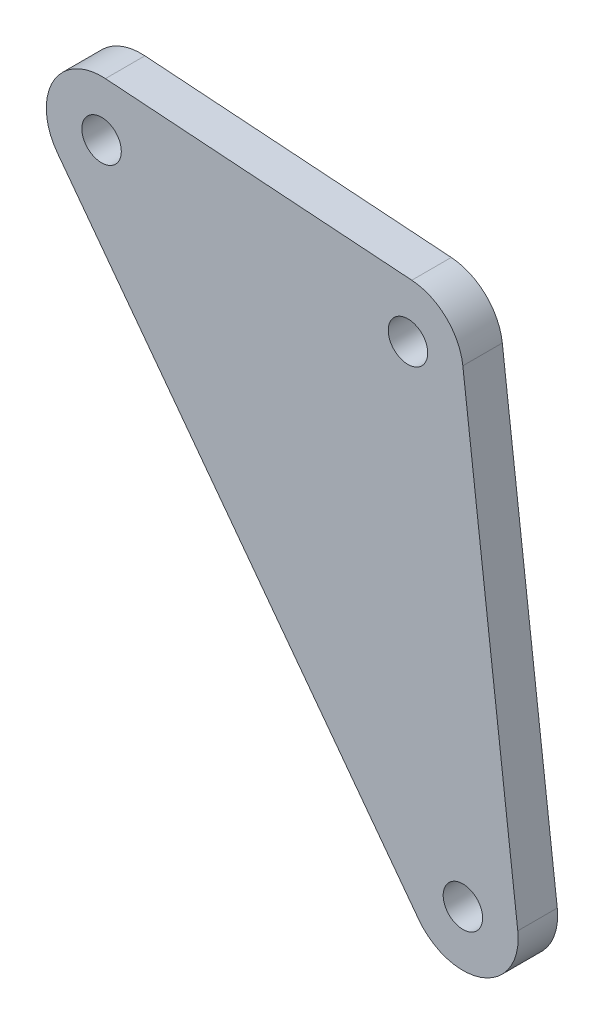
ISO-10303-21;
HEADER;
FILE_DESCRIPTION(('STEP AP214'),'2;1');
FILE_NAME('part.step','',(''),(''),'','','');
FILE_SCHEMA(('AUTOMOTIVE_DESIGN { 1 0 10303 214 1 1 1 1 }'));
ENDSEC;
DATA;
#1=APPLICATION_CONTEXT('core data for automotive mechanical design processes');
#2=APPLICATION_PROTOCOL_DEFINITION('international standard','automotive_design',2000,#1);
#3=PRODUCT_CONTEXT('',#1,'mechanical');
#4=PRODUCT('Part','Part','',(#3));
#5=PRODUCT_RELATED_PRODUCT_CATEGORY('part','',(#4));
#6=PRODUCT_DEFINITION_FORMATION('','',#4);
#7=PRODUCT_DEFINITION_CONTEXT('part definition',#1,'design');
#8=PRODUCT_DEFINITION('design','',#6,#7);
#9=PRODUCT_DEFINITION_SHAPE('','',#8);
#10=(LENGTH_UNIT() NAMED_UNIT(*) SI_UNIT(.MILLI.,.METRE.));
#11=(NAMED_UNIT(*) PLANE_ANGLE_UNIT() SI_UNIT($,.RADIAN.));
#12=(NAMED_UNIT(*) SI_UNIT($,.STERADIAN.) SOLID_ANGLE_UNIT());
#13=UNCERTAINTY_MEASURE_WITH_UNIT(LENGTH_MEASURE(1.E-05),#10,'distance_accuracy_value','');
#14=(GEOMETRIC_REPRESENTATION_CONTEXT(3) GLOBAL_UNCERTAINTY_ASSIGNED_CONTEXT((#13)) GLOBAL_UNIT_ASSIGNED_CONTEXT((#10,
#11,#12)) REPRESENTATION_CONTEXT('',''));
#15=CARTESIAN_POINT('',(0.,0.,0.));
#16=DIRECTION('',(0.,0.,1.));
#17=DIRECTION('',(1.,0.,0.));
#18=AXIS2_PLACEMENT_3D('',#15,#16,#17);
#19=CARTESIAN_POINT('',(0.,0.,6.35));
#20=DIRECTION('',(0.,0.,-1.));
#21=DIRECTION('',(-1.,0.,0.));
#22=AXIS2_PLACEMENT_3D('',#19,#20,#21);
#23=PLANE('',#22);
#24=DIRECTION('',(0.598839337600223,-0.800869182665013,0.));
#25=VECTOR('',#24,1.);
#26=CARTESIAN_POINT('',(63.0456676660732,-140.545952681482,6.35));
#27=LINE('',#26,#25);
#28=CARTESIAN_POINT('',(-14.9492145962334,-36.238012826056,6.35));
#29=VERTEX_POINT('',#28);
#30=CARTESIAN_POINT('',(43.1777245472698,-113.975180910618,6.35));
#31=VERTEX_POINT('',#30);
#32=EDGE_CURVE('E122',#29,#31,#27,.T.);
#33=ORIENTED_EDGE('',*,*,#32,.T.);
#34=CARTESIAN_POINT('',(50.2974515811618,-108.651499199352,6.35));
#35=DIRECTION('',(0.,0.,-1.));
#36=DIRECTION('',(-1.,0.,0.));
#37=AXIS2_PLACEMENT_3D('',#34,#35,#36);
#38=CIRCLE('',#37,8.89);
#39=CARTESIAN_POINT('',(59.1251650461889,-107.600987429128,6.35));
#40=VERTEX_POINT('',#39);
#41=EDGE_CURVE('E140',#31,#40,#38,.F.);
#42=ORIENTED_EDGE('',*,*,#41,.T.);
#43=DIRECTION('',(-0.118167803174829,0.99299364061047,0.));
#44=VECTOR('',#43,1.);
#45=CARTESIAN_POINT('',(49.4147627950383,-26.00204571997,6.35));
#46=LINE('',#45,#44);
#47=CARTESIAN_POINT('',(50.2840863482545,-33.3071892259338,6.35));
#48=VERTEX_POINT('',#47);
#49=EDGE_CURVE('E112',#40,#48,#46,.T.);
#50=ORIENTED_EDGE('',*,*,#49,.T.);
#51=CARTESIAN_POINT('',(41.4563728832274,-34.3577009961581,6.35));
#52=DIRECTION('',(0.,0.,-1.));
#53=DIRECTION('',(-1.,0.,0.));
#54=AXIS2_PLACEMENT_3D('',#51,#52,#53);
#55=CIRCLE('',#54,8.89);
#56=CARTESIAN_POINT('',(42.0759648001072,-25.489318626383,6.35));
#57=VERTEX_POINT('',#56);
#58=EDGE_CURVE('E56',#48,#57,#55,.F.);
#59=ORIENTED_EDGE('',*,*,#58,.T.);
#60=DIRECTION('',(-0.997568320559625,0.0696953787266334,0.));
#61=VECTOR('',#60,1.);
#62=CARTESIAN_POINT('',(-26.5726702065041,-20.6931632982265,6.35));
#63=LINE('',#62,#61);
#64=CARTESIAN_POINT('',(-7.20989564546165,-22.0459487450149,6.35));
#65=VERTEX_POINT('',#64);
#66=EDGE_CURVE('E130',#57,#65,#63,.T.);
#67=ORIENTED_EDGE('',*,*,#66,.T.);
#68=CARTESIAN_POINT('',(-7.82948756234142,-30.91433111479,6.35));
#69=DIRECTION('',(0.,0.,-1.));
#70=DIRECTION('',(-1.,0.,0.));
#71=AXIS2_PLACEMENT_3D('',#68,#69,#70);
#72=CIRCLE('',#71,8.89);
#73=EDGE_CURVE('E131',#65,#29,#72,.F.);
#74=ORIENTED_EDGE('',*,*,#73,.T.);
#75=EDGE_LOOP('',(#33,#42,#50,#59,#67,#74));
#76=FACE_BOUND('',#75,.T.);
#77=CARTESIAN_POINT('',(-7.82948756234141,-30.91433111479,6.35));
#78=DIRECTION('',(0.,0.,1.));
#79=DIRECTION('',(1.,0.,0.));
#80=AXIS2_PLACEMENT_3D('',#77,#78,#79);
#81=CIRCLE('',#80,3.175);
#82=CARTESIAN_POINT('',(-4.65448756234141,-30.91433111479,6.35));
#83=VERTEX_POINT('',#82);
#84=EDGE_CURVE('E124',#83,#83,#81,.T.);
#85=ORIENTED_EDGE('',*,*,#84,.F.);
#86=EDGE_LOOP('',(#85));
#87=FACE_BOUND('',#86,.T.);
#88=CARTESIAN_POINT('',(41.4563728832274,-34.3577009961581,6.35));
#89=DIRECTION('',(0.,0.,1.));
#90=DIRECTION('',(1.,0.,0.));
#91=AXIS2_PLACEMENT_3D('',#88,#89,#90);
#92=CIRCLE('',#91,3.175);
#93=CARTESIAN_POINT('',(44.6313728832274,-34.3577009961581,6.35));
#94=VERTEX_POINT('',#93);
#95=EDGE_CURVE('E163',#94,#94,#92,.T.);
#96=ORIENTED_EDGE('',*,*,#95,.F.);
#97=EDGE_LOOP('',(#96));
#98=FACE_BOUND('',#97,.T.);
#99=CARTESIAN_POINT('',(50.2974515811618,-108.651499199352,6.35));
#100=DIRECTION('',(0.,0.,1.));
#101=DIRECTION('',(1.,0.,0.));
#102=AXIS2_PLACEMENT_3D('',#99,#100,#101);
#103=CIRCLE('',#102,3.175);
#104=CARTESIAN_POINT('',(53.4724515811618,-108.651499199352,6.35));
#105=VERTEX_POINT('',#104);
#106=EDGE_CURVE('E170',#105,#105,#103,.T.);
#107=ORIENTED_EDGE('',*,*,#106,.F.);
#108=EDGE_LOOP('',(#107));
#109=FACE_BOUND('',#108,.T.);
#110=ADVANCED_FACE('F39',(#76,#87,#98,#109),#23,.F.);
#111=CARTESIAN_POINT('',(0.,0.,0.));
#112=DIRECTION('',(0.,0.,-1.));
#113=DIRECTION('',(-1.,0.,0.));
#114=AXIS2_PLACEMENT_3D('',#111,#112,#113);
#115=PLANE('',#114);
#116=CARTESIAN_POINT('',(41.4563728832274,-34.3577009961581,0.));
#117=DIRECTION('',(0.,0.,1.));
#118=DIRECTION('',(1.,0.,0.));
#119=AXIS2_PLACEMENT_3D('',#116,#117,#118);
#120=CIRCLE('',#119,3.175);
#121=CARTESIAN_POINT('',(44.6313728832274,-34.3577009961581,0.));
#122=VERTEX_POINT('',#121);
#123=EDGE_CURVE('E166',#122,#122,#120,.T.);
#124=ORIENTED_EDGE('',*,*,#123,.T.);
#125=EDGE_LOOP('',(#124));
#126=FACE_BOUND('',#125,.T.);
#127=DIRECTION('',(-0.118167803174829,0.99299364061047,0.));
#128=VECTOR('',#127,1.);
#129=CARTESIAN_POINT('',(49.4147627950383,-26.00204571997,0.));
#130=LINE('',#129,#128);
#131=CARTESIAN_POINT('',(59.1251650461889,-107.600987429128,0.));
#132=VERTEX_POINT('',#131);
#133=CARTESIAN_POINT('',(50.2840863482545,-33.3071892259338,0.));
#134=VERTEX_POINT('',#133);
#135=EDGE_CURVE('E108',#132,#134,#130,.T.);
#136=ORIENTED_EDGE('',*,*,#135,.F.);
#137=CARTESIAN_POINT('',(50.2974515811618,-108.651499199352,0.));
#138=DIRECTION('',(0.,0.,-1.));
#139=DIRECTION('',(-1.,0.,0.));
#140=AXIS2_PLACEMENT_3D('',#137,#138,#139);
#141=CIRCLE('',#140,8.89);
#142=CARTESIAN_POINT('',(43.1777245472698,-113.975180910618,0.));
#143=VERTEX_POINT('',#142);
#144=EDGE_CURVE('E95',#132,#143,#141,.T.);
#145=ORIENTED_EDGE('',*,*,#144,.T.);
#146=DIRECTION('',(0.598839337600223,-0.800869182665013,0.));
#147=VECTOR('',#146,1.);
#148=CARTESIAN_POINT('',(63.0456676660732,-140.545952681482,0.));
#149=LINE('',#148,#147);
#150=CARTESIAN_POINT('',(-14.9492145962334,-36.238012826056,0.));
#151=VERTEX_POINT('',#150);
#152=EDGE_CURVE('E120',#151,#143,#149,.T.);
#153=ORIENTED_EDGE('',*,*,#152,.F.);
#154=CARTESIAN_POINT('',(-7.82948756234142,-30.91433111479,0.));
#155=DIRECTION('',(0.,0.,-1.));
#156=DIRECTION('',(-1.,0.,0.));
#157=AXIS2_PLACEMENT_3D('',#154,#155,#156);
#158=CIRCLE('',#157,8.89);
#159=CARTESIAN_POINT('',(-7.20989564546165,-22.0459487450149,0.));
#160=VERTEX_POINT('',#159);
#161=EDGE_CURVE('E103',#151,#160,#158,.T.);
#162=ORIENTED_EDGE('',*,*,#161,.T.);
#163=DIRECTION('',(-0.997568320559625,0.0696953787266334,0.));
#164=VECTOR('',#163,1.);
#165=CARTESIAN_POINT('',(-26.5726702065041,-20.6931632982265,0.));
#166=LINE('',#165,#164);
#167=CARTESIAN_POINT('',(42.0759648001072,-25.489318626383,0.));
#168=VERTEX_POINT('',#167);
#169=EDGE_CURVE('E117',#168,#160,#166,.T.);
#170=ORIENTED_EDGE('',*,*,#169,.F.);
#171=CARTESIAN_POINT('',(41.4563728832274,-34.3577009961581,0.));
#172=DIRECTION('',(0.,0.,-1.));
#173=DIRECTION('',(-1.,0.,0.));
#174=AXIS2_PLACEMENT_3D('',#171,#172,#173);
#175=CIRCLE('',#174,8.89);
#176=EDGE_CURVE('E115',#168,#134,#175,.T.);
#177=ORIENTED_EDGE('',*,*,#176,.T.);
#178=EDGE_LOOP('',(#136,#145,#153,#162,#170,#177));
#179=FACE_BOUND('',#178,.T.);
#180=CARTESIAN_POINT('',(-7.82948756234141,-30.91433111479,0.));
#181=DIRECTION('',(0.,0.,1.));
#182=DIRECTION('',(1.,0.,0.));
#183=AXIS2_PLACEMENT_3D('',#180,#181,#182);
#184=CIRCLE('',#183,3.175);
#185=CARTESIAN_POINT('',(-4.65448756234141,-30.91433111479,0.));
#186=VERTEX_POINT('',#185);
#187=EDGE_CURVE('E153',#186,#186,#184,.T.);
#188=ORIENTED_EDGE('',*,*,#187,.T.);
#189=EDGE_LOOP('',(#188));
#190=FACE_BOUND('',#189,.T.);
#191=CARTESIAN_POINT('',(50.2974515811618,-108.651499199352,0.));
#192=DIRECTION('',(0.,0.,1.));
#193=DIRECTION('',(1.,0.,0.));
#194=AXIS2_PLACEMENT_3D('',#191,#192,#193);
#195=CIRCLE('',#194,3.175);
#196=CARTESIAN_POINT('',(53.4724515811618,-108.651499199352,0.));
#197=VERTEX_POINT('',#196);
#198=EDGE_CURVE('E168',#197,#197,#195,.T.);
#199=ORIENTED_EDGE('',*,*,#198,.T.);
#200=EDGE_LOOP('',(#199));
#201=FACE_BOUND('',#200,.T.);
#202=ADVANCED_FACE('F113',(#126,#179,#190,#201),#115,.T.);
#203=CARTESIAN_POINT('',(63.0456676660732,-140.545952681482,6.35));
#204=DIRECTION('',(0.800869182665013,0.598839337600223,0.));
#205=DIRECTION('',(-0.598839337600223,0.800869182665013,0.));
#206=AXIS2_PLACEMENT_3D('',#203,#204,#205);
#207=PLANE('',#206);
#208=ORIENTED_EDGE('',*,*,#152,.T.);
#209=DIRECTION('',(0.,0.,-1.));
#210=VECTOR('',#209,1.);
#211=CARTESIAN_POINT('',(43.1777245472698,-113.975180910618,6.35));
#212=LINE('',#211,#210);
#213=EDGE_CURVE('E100',#143,#31,#212,.F.);
#214=ORIENTED_EDGE('',*,*,#213,.T.);
#215=ORIENTED_EDGE('',*,*,#32,.F.);
#216=DIRECTION('',(0.,0.,-1.));
#217=VECTOR('',#216,1.);
#218=CARTESIAN_POINT('',(-14.9492145962334,-36.238012826056,6.35));
#219=LINE('',#218,#217);
#220=EDGE_CURVE('E105',#29,#151,#219,.T.);
#221=ORIENTED_EDGE('',*,*,#220,.T.);
#222=EDGE_LOOP('',(#208,#214,#215,#221));
#223=FACE_BOUND('',#222,.T.);
#224=ADVANCED_FACE('F146',(#223),#207,.F.);
#225=CARTESIAN_POINT('',(49.4147627950383,-26.00204571997,6.35));
#226=DIRECTION('',(-0.99299364061047,-0.118167803174829,0.));
#227=DIRECTION('',(0.118167803174829,-0.99299364061047,0.));
#228=AXIS2_PLACEMENT_3D('',#225,#226,#227);
#229=PLANE('',#228);
#230=ORIENTED_EDGE('',*,*,#49,.F.);
#231=DIRECTION('',(0.,0.,-1.));
#232=VECTOR('',#231,1.);
#233=CARTESIAN_POINT('',(59.1251650461889,-107.600987429128,6.35));
#234=LINE('',#233,#232);
#235=EDGE_CURVE('E96',#40,#132,#234,.T.);
#236=ORIENTED_EDGE('',*,*,#235,.T.);
#237=ORIENTED_EDGE('',*,*,#135,.T.);
#238=DIRECTION('',(0.,0.,-1.));
#239=VECTOR('',#238,1.);
#240=CARTESIAN_POINT('',(50.2840863482545,-33.3071892259338,6.35));
#241=LINE('',#240,#239);
#242=EDGE_CURVE('E114',#134,#48,#241,.F.);
#243=ORIENTED_EDGE('',*,*,#242,.T.);
#244=EDGE_LOOP('',(#230,#236,#237,#243));
#245=FACE_BOUND('',#244,.T.);
#246=ADVANCED_FACE('F107',(#245),#229,.F.);
#247=CARTESIAN_POINT('',(-26.5726702065041,-20.6931632982265,6.35));
#248=DIRECTION('',(-0.0696953787266334,-0.997568320559625,0.));
#249=DIRECTION('',(0.997568320559625,-0.0696953787266334,0.));
#250=AXIS2_PLACEMENT_3D('',#247,#248,#249);
#251=PLANE('',#250);
#252=ORIENTED_EDGE('',*,*,#169,.T.);
#253=DIRECTION('',(0.,0.,-1.));
#254=VECTOR('',#253,1.);
#255=CARTESIAN_POINT('',(-7.20989564546165,-22.0459487450149,6.35));
#256=LINE('',#255,#254);
#257=EDGE_CURVE('E11',#160,#65,#256,.F.);
#258=ORIENTED_EDGE('',*,*,#257,.T.);
#259=ORIENTED_EDGE('',*,*,#66,.F.);
#260=DIRECTION('',(0.,0.,-1.));
#261=VECTOR('',#260,1.);
#262=CARTESIAN_POINT('',(42.0759648001072,-25.489318626383,6.35));
#263=LINE('',#262,#261);
#264=EDGE_CURVE('E50',#57,#168,#263,.T.);
#265=ORIENTED_EDGE('',*,*,#264,.T.);
#266=EDGE_LOOP('',(#252,#258,#259,#265));
#267=FACE_BOUND('',#266,.T.);
#268=ADVANCED_FACE('F138',(#267),#251,.F.);
#269=CARTESIAN_POINT('',(-7.82948756234141,-30.91433111479,6.35));
#270=DIRECTION('',(0.,0.,-1.));
#271=DIRECTION('',(-1.,0.,0.));
#272=AXIS2_PLACEMENT_3D('',#269,#270,#271);
#273=CYLINDRICAL_SURFACE('',#272,3.175);
#274=ORIENTED_EDGE('',*,*,#84,.T.);
#275=EDGE_LOOP('',(#274));
#276=FACE_BOUND('',#275,.T.);
#277=ORIENTED_EDGE('',*,*,#187,.F.);
#278=EDGE_LOOP('',(#277));
#279=FACE_BOUND('',#278,.T.);
#280=ADVANCED_FACE('F185',(#276,#279),#273,.F.);
#281=CARTESIAN_POINT('',(41.4563728832274,-34.3577009961581,6.35));
#282=DIRECTION('',(0.,0.,-1.));
#283=DIRECTION('',(-1.,0.,0.));
#284=AXIS2_PLACEMENT_3D('',#281,#282,#283);
#285=CYLINDRICAL_SURFACE('',#284,3.175);
#286=ORIENTED_EDGE('',*,*,#95,.T.);
#287=EDGE_LOOP('',(#286));
#288=FACE_BOUND('',#287,.T.);
#289=ORIENTED_EDGE('',*,*,#123,.F.);
#290=EDGE_LOOP('',(#289));
#291=FACE_BOUND('',#290,.T.);
#292=ADVANCED_FACE('F184',(#288,#291),#285,.F.);
#293=CARTESIAN_POINT('',(50.2974515811618,-108.651499199352,6.35));
#294=DIRECTION('',(0.,0.,-1.));
#295=DIRECTION('',(-1.,0.,0.));
#296=AXIS2_PLACEMENT_3D('',#293,#294,#295);
#297=CYLINDRICAL_SURFACE('',#296,3.175);
#298=ORIENTED_EDGE('',*,*,#106,.T.);
#299=EDGE_LOOP('',(#298));
#300=FACE_BOUND('',#299,.T.);
#301=ORIENTED_EDGE('',*,*,#198,.F.);
#302=EDGE_LOOP('',(#301));
#303=FACE_BOUND('',#302,.T.);
#304=ADVANCED_FACE('F190',(#300,#303),#297,.F.);
#305=CARTESIAN_POINT('',(50.2974515811618,-108.651499199352,6.35));
#306=DIRECTION('',(0.,0.,-1.));
#307=DIRECTION('',(-1.,0.,0.));
#308=AXIS2_PLACEMENT_3D('',#305,#306,#307);
#309=CYLINDRICAL_SURFACE('',#308,8.89);
#310=ORIENTED_EDGE('',*,*,#41,.F.);
#311=ORIENTED_EDGE('',*,*,#213,.F.);
#312=ORIENTED_EDGE('',*,*,#144,.F.);
#313=ORIENTED_EDGE('',*,*,#235,.F.);
#314=EDGE_LOOP('',(#310,#311,#312,#313));
#315=FACE_BOUND('',#314,.T.);
#316=ADVANCED_FACE('F92',(#315),#309,.T.);
#317=CARTESIAN_POINT('',(-7.82948756234142,-30.91433111479,6.35));
#318=DIRECTION('',(0.,0.,-1.));
#319=DIRECTION('',(-1.,0.,0.));
#320=AXIS2_PLACEMENT_3D('',#317,#318,#319);
#321=CYLINDRICAL_SURFACE('',#320,8.89);
#322=ORIENTED_EDGE('',*,*,#73,.F.);
#323=ORIENTED_EDGE('',*,*,#257,.F.);
#324=ORIENTED_EDGE('',*,*,#161,.F.);
#325=ORIENTED_EDGE('',*,*,#220,.F.);
#326=EDGE_LOOP('',(#322,#323,#324,#325));
#327=FACE_BOUND('',#326,.T.);
#328=ADVANCED_FACE('F144',(#327),#321,.T.);
#329=CARTESIAN_POINT('',(41.4563728832274,-34.3577009961581,6.35));
#330=DIRECTION('',(0.,0.,-1.));
#331=DIRECTION('',(-1.,0.,0.));
#332=AXIS2_PLACEMENT_3D('',#329,#330,#331);
#333=CYLINDRICAL_SURFACE('',#332,8.89);
#334=ORIENTED_EDGE('',*,*,#58,.F.);
#335=ORIENTED_EDGE('',*,*,#242,.F.);
#336=ORIENTED_EDGE('',*,*,#176,.F.);
#337=ORIENTED_EDGE('',*,*,#264,.F.);
#338=EDGE_LOOP('',(#334,#335,#336,#337));
#339=FACE_BOUND('',#338,.T.);
#340=ADVANCED_FACE('F41',(#339),#333,.T.);
#341=CLOSED_SHELL('',(#110,#202,#224,#246,#268,#280,#292,#304,#316,#328,#340));
#342=MANIFOLD_SOLID_BREP('B2',#341);
#343=ADVANCED_BREP_SHAPE_REPRESENTATION('',(#18,#342),#14);
#344=SHAPE_DEFINITION_REPRESENTATION(#9,#343);
ENDSEC;
END-ISO-10303-21;
